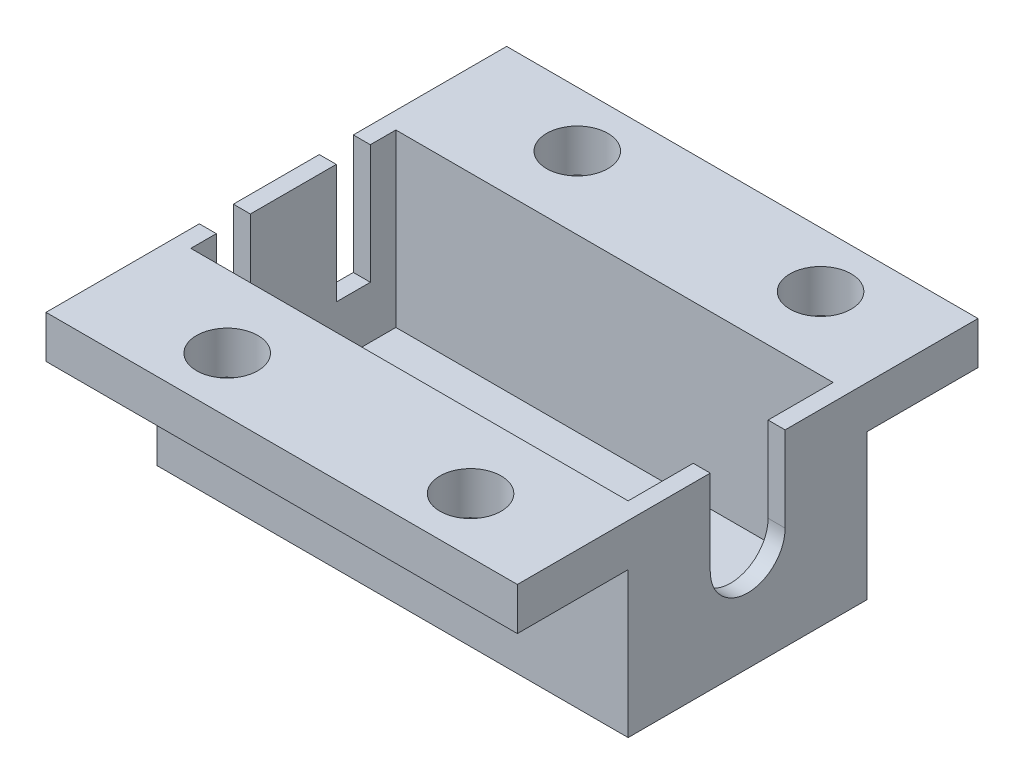
ISO-10303-21;
HEADER;
FILE_DESCRIPTION(('STEP AP214'),'2;1');
FILE_NAME('part.step','',(''),(''),'','','');
FILE_SCHEMA(('AUTOMOTIVE_DESIGN { 1 0 10303 214 1 1 1 1 }'));
ENDSEC;
DATA;
#1=APPLICATION_CONTEXT('core data for automotive mechanical design processes');
#2=APPLICATION_PROTOCOL_DEFINITION('international standard','automotive_design',2000,#1);
#3=PRODUCT_CONTEXT('',#1,'mechanical');
#4=PRODUCT('Part','Part','',(#3));
#5=PRODUCT_RELATED_PRODUCT_CATEGORY('part','',(#4));
#6=PRODUCT_DEFINITION_FORMATION('','',#4);
#7=PRODUCT_DEFINITION_CONTEXT('part definition',#1,'design');
#8=PRODUCT_DEFINITION('design','',#6,#7);
#9=PRODUCT_DEFINITION_SHAPE('','',#8);
#10=(LENGTH_UNIT() NAMED_UNIT(*) SI_UNIT(.MILLI.,.METRE.));
#11=(NAMED_UNIT(*) PLANE_ANGLE_UNIT() SI_UNIT($,.RADIAN.));
#12=(NAMED_UNIT(*) SI_UNIT($,.STERADIAN.) SOLID_ANGLE_UNIT());
#13=UNCERTAINTY_MEASURE_WITH_UNIT(LENGTH_MEASURE(1.E-05),#10,'distance_accuracy_value','');
#14=(GEOMETRIC_REPRESENTATION_CONTEXT(3) GLOBAL_UNCERTAINTY_ASSIGNED_CONTEXT((#13)) GLOBAL_UNIT_ASSIGNED_CONTEXT((#10,
#11,#12)) REPRESENTATION_CONTEXT('',''));
#15=CARTESIAN_POINT('',(0.,0.,0.));
#16=DIRECTION('',(0.,0.,1.));
#17=DIRECTION('',(1.,0.,0.));
#18=AXIS2_PLACEMENT_3D('',#15,#16,#17);
#19=CARTESIAN_POINT('',(0.,11.05,0.));
#20=DIRECTION('',(0.,1.,0.));
#21=DIRECTION('',(0.,0.,1.));
#22=AXIS2_PLACEMENT_3D('',#19,#20,#21);
#23=PLANE('',#22);
#24=DIRECTION('',(-1.,0.,0.));
#25=VECTOR('',#24,1.);
#26=CARTESIAN_POINT('',(0.,11.05,-4.5));
#27=LINE('',#26,#25);
#28=CARTESIAN_POINT('',(-0.399999999999999,11.05,-4.5));
#29=VERTEX_POINT('',#28);
#30=CARTESIAN_POINT('',(-1.4,11.05,-4.5));
#31=VERTEX_POINT('',#30);
#32=EDGE_CURVE('E240',#29,#31,#27,.T.);
#33=ORIENTED_EDGE('',*,*,#32,.F.);
#34=DIRECTION('',(0.,0.,1.));
#35=VECTOR('',#34,1.);
#36=CARTESIAN_POINT('',(-0.4,11.05,-13.05));
#37=LINE('',#36,#35);
#38=CARTESIAN_POINT('',(-0.399999999999999,11.05,-9.55));
#39=VERTEX_POINT('',#38);
#40=EDGE_CURVE('E309',#39,#29,#37,.T.);
#41=ORIENTED_EDGE('',*,*,#40,.F.);
#42=DIRECTION('',(-1.,0.,0.));
#43=VECTOR('',#42,1.);
#44=CARTESIAN_POINT('',(0.,11.05,-9.55));
#45=LINE('',#44,#43);
#46=CARTESIAN_POINT('',(-1.4,11.05,-9.55));
#47=VERTEX_POINT('',#46);
#48=EDGE_CURVE('E314',#39,#47,#45,.T.);
#49=ORIENTED_EDGE('',*,*,#48,.T.);
#50=DIRECTION('',(0.,0.,-1.));
#51=VECTOR('',#50,1.);
#52=CARTESIAN_POINT('',(-1.4,11.05,6.51));
#53=LINE('',#52,#51);
#54=EDGE_CURVE('E248',#31,#47,#53,.T.);
#55=ORIENTED_EDGE('',*,*,#54,.F.);
#56=EDGE_LOOP('',(#33,#41,#49,#55));
#57=FACE_BOUND('',#56,.T.);
#58=ADVANCED_FACE('F34',(#57),#23,.T.);
#59=DIRECTION('',(-1.,0.,0.));
#60=VECTOR('',#59,1.);
#61=CARTESIAN_POINT('',(0.,11.05,-11.55));
#62=LINE('',#61,#60);
#63=CARTESIAN_POINT('',(-0.4,11.05,-11.55));
#64=VERTEX_POINT('',#63);
#65=CARTESIAN_POINT('',(-1.4,11.05,-11.55));
#66=VERTEX_POINT('',#65);
#67=EDGE_CURVE('E313',#64,#66,#62,.T.);
#68=ORIENTED_EDGE('',*,*,#67,.F.);
#69=CARTESIAN_POINT('',(-0.4,11.05,-13.05));
#70=VERTEX_POINT('',#69);
#71=EDGE_CURVE('E306',#70,#64,#37,.T.);
#72=ORIENTED_EDGE('',*,*,#71,.F.);
#73=DIRECTION('',(-1.,0.,0.));
#74=VECTOR('',#73,1.);
#75=CARTESIAN_POINT('',(0.,11.05,-13.05));
#76=LINE('',#75,#74);
#77=CARTESIAN_POINT('',(25.3,11.05,-13.05));
#78=VERTEX_POINT('',#77);
#79=EDGE_CURVE('E481',#78,#70,#76,.T.);
#80=ORIENTED_EDGE('',*,*,#79,.F.);
#81=DIRECTION('',(0.,0.,1.));
#82=VECTOR('',#81,1.);
#83=CARTESIAN_POINT('',(25.3,11.05,0.));
#84=LINE('',#83,#82);
#85=CARTESIAN_POINT('',(25.3,11.05,-9.225));
#86=VERTEX_POINT('',#85);
#87=EDGE_CURVE('E484',#78,#86,#84,.T.);
#88=ORIENTED_EDGE('',*,*,#87,.T.);
#89=DIRECTION('',(-1.,0.,0.));
#90=VECTOR('',#89,1.);
#91=CARTESIAN_POINT('',(0.,11.05,-9.225));
#92=LINE('',#91,#90);
#93=CARTESIAN_POINT('',(26.3,11.05,-9.225));
#94=VERTEX_POINT('',#93);
#95=EDGE_CURVE('E387',#94,#86,#92,.T.);
#96=ORIENTED_EDGE('',*,*,#95,.F.);
#97=DIRECTION('',(0.,0.,-1.));
#98=VECTOR('',#97,1.);
#99=CARTESIAN_POINT('',(26.3,11.05,0.));
#100=LINE('',#99,#98);
#101=CARTESIAN_POINT('',(26.3,11.05,-20.56));
#102=VERTEX_POINT('',#101);
#103=EDGE_CURVE('E351',#94,#102,#100,.T.);
#104=ORIENTED_EDGE('',*,*,#103,.T.);
#105=DIRECTION('',(-1.,0.,0.));
#106=VECTOR('',#105,1.);
#107=CARTESIAN_POINT('',(0.,11.05,-20.56));
#108=LINE('',#107,#106);
#109=CARTESIAN_POINT('',(-1.4,11.05,-20.56));
#110=VERTEX_POINT('',#109);
#111=EDGE_CURVE('E347',#102,#110,#108,.T.);
#112=ORIENTED_EDGE('',*,*,#111,.T.);
#113=EDGE_CURVE('E250',#66,#110,#53,.T.);
#114=ORIENTED_EDGE('',*,*,#113,.F.);
#115=EDGE_LOOP('',(#68,#72,#80,#88,#96,#104,#112,#114));
#116=FACE_BOUND('',#115,.T.);
#117=CARTESIAN_POINT('',(6.,11.05,-17.31));
#118=DIRECTION('',(0.,1.,0.));
#119=DIRECTION('',(0.,0.,1.));
#120=AXIS2_PLACEMENT_3D('',#117,#118,#119);
#121=CIRCLE('',#120,1.8);
#122=CARTESIAN_POINT('',(6.,11.05,-15.51));
#123=VERTEX_POINT('',#122);
#124=EDGE_CURVE('E441',#123,#123,#121,.T.);
#125=ORIENTED_EDGE('',*,*,#124,.F.);
#126=EDGE_LOOP('',(#125));
#127=FACE_BOUND('',#126,.T.);
#128=CARTESIAN_POINT('',(20.3,11.05,-17.31));
#129=DIRECTION('',(0.,1.,0.));
#130=DIRECTION('',(0.,0.,1.));
#131=AXIS2_PLACEMENT_3D('',#128,#129,#130);
#132=CIRCLE('',#131,1.8);
#133=CARTESIAN_POINT('',(20.3,11.05,-15.51));
#134=VERTEX_POINT('',#133);
#135=EDGE_CURVE('E437',#134,#134,#132,.T.);
#136=ORIENTED_EDGE('',*,*,#135,.F.);
#137=EDGE_LOOP('',(#136));
#138=FACE_BOUND('',#137,.T.);
#139=ADVANCED_FACE('F344',(#116,#127,#138),#23,.T.);
#140=CARTESIAN_POINT('',(0.,1.,0.));
#141=DIRECTION('',(0.,0.,-1.));
#142=DIRECTION('',(-1.,0.,0.));
#143=AXIS2_PLACEMENT_3D('',#140,#141,#142);
#144=PLANE('',#143);
#145=DIRECTION('',(0.,-1.,0.));
#146=VECTOR('',#145,1.);
#147=CARTESIAN_POINT('',(26.3,1.,0.));
#148=LINE('',#147,#146);
#149=CARTESIAN_POINT('',(26.3,8.55,0.));
#150=VERTEX_POINT('',#149);
#151=CARTESIAN_POINT('',(26.3,0.,0.));
#152=VERTEX_POINT('',#151);
#153=EDGE_CURVE('E378',#150,#152,#148,.T.);
#154=ORIENTED_EDGE('',*,*,#153,.F.);
#155=DIRECTION('',(-1.,0.,0.));
#156=VECTOR('',#155,1.);
#157=CARTESIAN_POINT('',(0.,8.55,0.));
#158=LINE('',#157,#156);
#159=CARTESIAN_POINT('',(-1.4,8.55,0.));
#160=VERTEX_POINT('',#159);
#161=EDGE_CURVE('E475',#150,#160,#158,.T.);
#162=ORIENTED_EDGE('',*,*,#161,.T.);
#163=DIRECTION('',(0.,1.,0.));
#164=VECTOR('',#163,1.);
#165=CARTESIAN_POINT('',(-1.4,0.,0.));
#166=LINE('',#165,#164);
#167=CARTESIAN_POINT('',(-1.4,0.,0.));
#168=VERTEX_POINT('',#167);
#169=EDGE_CURVE('E260',#168,#160,#166,.T.);
#170=ORIENTED_EDGE('',*,*,#169,.F.);
#171=DIRECTION('',(1.,0.,0.));
#172=VECTOR('',#171,1.);
#173=CARTESIAN_POINT('',(0.,0.,0.));
#174=LINE('',#173,#172);
#175=EDGE_CURVE('E380',#168,#152,#174,.T.);
#176=ORIENTED_EDGE('',*,*,#175,.T.);
#177=EDGE_LOOP('',(#154,#162,#170,#176));
#178=FACE_BOUND('',#177,.T.);
#179=ADVANCED_FACE('F36',(#178),#144,.F.);
#180=CARTESIAN_POINT('',(26.3,1.,0.));
#181=DIRECTION('',(-1.,0.,0.));
#182=DIRECTION('',(0.,0.,1.));
#183=AXIS2_PLACEMENT_3D('',#180,#181,#182);
#184=PLANE('',#183);
#185=DIRECTION('',(0.,1.,0.));
#186=VECTOR('',#185,1.);
#187=CARTESIAN_POINT('',(26.3,11.05,-9.225));
#188=LINE('',#187,#186);
#189=CARTESIAN_POINT('',(26.3,6.05,-9.225));
#190=VERTEX_POINT('',#189);
#191=EDGE_CURVE('E421',#190,#94,#188,.T.);
#192=ORIENTED_EDGE('',*,*,#191,.F.);
#193=CARTESIAN_POINT('',(26.3,6.05,-7.025));
#194=DIRECTION('',(1.,0.,0.));
#195=DIRECTION('',(0.,0.,-1.));
#196=AXIS2_PLACEMENT_3D('',#193,#194,#195);
#197=CIRCLE('',#196,2.2);
#198=CARTESIAN_POINT('',(26.3,6.05,-4.825));
#199=VERTEX_POINT('',#198);
#200=EDGE_CURVE('E411',#199,#190,#197,.T.);
#201=ORIENTED_EDGE('',*,*,#200,.F.);
#202=DIRECTION('',(0.,-1.,0.));
#203=VECTOR('',#202,1.);
#204=CARTESIAN_POINT('',(26.3,11.05,-4.825));
#205=LINE('',#204,#203);
#206=CARTESIAN_POINT('',(26.3,11.05,-4.825));
#207=VERTEX_POINT('',#206);
#208=EDGE_CURVE('E423',#207,#199,#205,.T.);
#209=ORIENTED_EDGE('',*,*,#208,.F.);
#210=CARTESIAN_POINT('',(26.3,11.05,6.51));
#211=VERTEX_POINT('',#210);
#212=EDGE_CURVE('E478',#211,#207,#100,.T.);
#213=ORIENTED_EDGE('',*,*,#212,.F.);
#214=DIRECTION('',(0.,1.,0.));
#215=VECTOR('',#214,1.);
#216=CARTESIAN_POINT('',(26.3,8.55,6.51));
#217=LINE('',#216,#215);
#218=CARTESIAN_POINT('',(26.3,8.55,6.51));
#219=VERTEX_POINT('',#218);
#220=EDGE_CURVE('E468',#219,#211,#217,.T.);
#221=ORIENTED_EDGE('',*,*,#220,.F.);
#222=DIRECTION('',(0.,0.,-1.));
#223=VECTOR('',#222,1.);
#224=CARTESIAN_POINT('',(26.3,8.55,6.51));
#225=LINE('',#224,#223);
#226=EDGE_CURVE('E464',#219,#150,#225,.T.);
#227=ORIENTED_EDGE('',*,*,#226,.T.);
#228=ORIENTED_EDGE('',*,*,#153,.T.);
#229=DIRECTION('',(0.,0.,-1.));
#230=VECTOR('',#229,1.);
#231=CARTESIAN_POINT('',(26.3,0.,0.));
#232=LINE('',#231,#230);
#233=CARTESIAN_POINT('',(26.3,0.,-14.05));
#234=VERTEX_POINT('',#233);
#235=EDGE_CURVE('E376',#152,#234,#232,.T.);
#236=ORIENTED_EDGE('',*,*,#235,.T.);
#237=DIRECTION('',(0.,-1.,0.));
#238=VECTOR('',#237,1.);
#239=CARTESIAN_POINT('',(26.3,1.,-14.05));
#240=LINE('',#239,#238);
#241=CARTESIAN_POINT('',(26.3,8.55,-14.05));
#242=VERTEX_POINT('',#241);
#243=EDGE_CURVE('E372',#242,#234,#240,.T.);
#244=ORIENTED_EDGE('',*,*,#243,.F.);
#245=CARTESIAN_POINT('',(26.3,8.55,-20.56));
#246=VERTEX_POINT('',#245);
#247=EDGE_CURVE('E463',#242,#246,#225,.T.);
#248=ORIENTED_EDGE('',*,*,#247,.T.);
#249=DIRECTION('',(0.,1.,0.));
#250=VECTOR('',#249,1.);
#251=CARTESIAN_POINT('',(26.3,8.55,-20.56));
#252=LINE('',#251,#250);
#253=EDGE_CURVE('E470',#246,#102,#252,.T.);
#254=ORIENTED_EDGE('',*,*,#253,.T.);
#255=ORIENTED_EDGE('',*,*,#103,.F.);
#256=EDGE_LOOP('',(#192,#201,#209,#213,#221,#227,#228,#236,#244,#248,#254,#255));
#257=FACE_BOUND('',#256,.T.);
#258=ADVANCED_FACE('F507',(#257),#184,.F.);
#259=CARTESIAN_POINT('',(0.,1.,-14.05));
#260=DIRECTION('',(0.,0.,1.));
#261=DIRECTION('',(1.,0.,0.));
#262=AXIS2_PLACEMENT_3D('',#259,#260,#261);
#263=PLANE('',#262);
#264=DIRECTION('',(-1.,0.,0.));
#265=VECTOR('',#264,1.);
#266=CARTESIAN_POINT('',(0.,0.,-14.05));
#267=LINE('',#266,#265);
#268=CARTESIAN_POINT('',(-1.4,0.,-14.05));
#269=VERTEX_POINT('',#268);
#270=EDGE_CURVE('E371',#234,#269,#267,.T.);
#271=ORIENTED_EDGE('',*,*,#270,.T.);
#272=DIRECTION('',(0.,-1.,0.));
#273=VECTOR('',#272,1.);
#274=CARTESIAN_POINT('',(-1.4,8.55,-14.05));
#275=LINE('',#274,#273);
#276=CARTESIAN_POINT('',(-1.4,8.55,-14.05));
#277=VERTEX_POINT('',#276);
#278=EDGE_CURVE('E268',#277,#269,#275,.T.);
#279=ORIENTED_EDGE('',*,*,#278,.F.);
#280=DIRECTION('',(1.,0.,0.));
#281=VECTOR('',#280,1.);
#282=CARTESIAN_POINT('',(0.,8.55,-14.05));
#283=LINE('',#282,#281);
#284=EDGE_CURVE('E368',#277,#242,#283,.T.);
#285=ORIENTED_EDGE('',*,*,#284,.T.);
#286=ORIENTED_EDGE('',*,*,#243,.T.);
#287=EDGE_LOOP('',(#271,#279,#285,#286));
#288=FACE_BOUND('',#287,.T.);
#289=ADVANCED_FACE('F367',(#288),#263,.F.);
#290=CARTESIAN_POINT('',(0.,0.,0.));
#291=DIRECTION('',(0.,-1.,0.));
#292=DIRECTION('',(0.,0.,-1.));
#293=AXIS2_PLACEMENT_3D('',#290,#291,#292);
#294=PLANE('',#293);
#295=DIRECTION('',(1.,0.,0.));
#296=VECTOR('',#295,1.);
#297=CARTESIAN_POINT('',(14.5,0.,-11.025));
#298=LINE('',#297,#296);
#299=CARTESIAN_POINT('',(4.5,0.,-11.025));
#300=VERTEX_POINT('',#299);
#301=CARTESIAN_POINT('',(14.5,0.,-11.025));
#302=VERTEX_POINT('',#301);
#303=EDGE_CURVE('E410',#300,#302,#298,.T.);
#304=ORIENTED_EDGE('',*,*,#303,.F.);
#305=DIRECTION('',(0.,0.,1.));
#306=VECTOR('',#305,1.);
#307=CARTESIAN_POINT('',(4.5,0.,-3.025));
#308=LINE('',#307,#306);
#309=CARTESIAN_POINT('',(4.5,0.,-3.025));
#310=VERTEX_POINT('',#309);
#311=EDGE_CURVE('E247',#300,#310,#308,.T.);
#312=ORIENTED_EDGE('',*,*,#311,.T.);
#313=DIRECTION('',(-1.,0.,0.));
#314=VECTOR('',#313,1.);
#315=CARTESIAN_POINT('',(14.5,0.,-3.025));
#316=LINE('',#315,#314);
#317=CARTESIAN_POINT('',(14.5,0.,-3.025));
#318=VERTEX_POINT('',#317);
#319=EDGE_CURVE('E927',#318,#310,#316,.T.);
#320=ORIENTED_EDGE('',*,*,#319,.F.);
#321=DIRECTION('',(0.,0.,1.));
#322=VECTOR('',#321,1.);
#323=CARTESIAN_POINT('',(14.5,0.,-11.025));
#324=LINE('',#323,#322);
#325=EDGE_CURVE('E925',#302,#318,#324,.T.);
#326=ORIENTED_EDGE('',*,*,#325,.F.);
#327=EDGE_LOOP('',(#304,#312,#320,#326));
#328=FACE_BOUND('',#327,.T.);
#329=ORIENTED_EDGE('',*,*,#175,.F.);
#330=DIRECTION('',(0.,0.,1.));
#331=VECTOR('',#330,1.);
#332=CARTESIAN_POINT('',(-1.4,0.,-14.05));
#333=LINE('',#332,#331);
#334=EDGE_CURVE('E265',#269,#168,#333,.T.);
#335=ORIENTED_EDGE('',*,*,#334,.F.);
#336=ORIENTED_EDGE('',*,*,#270,.F.);
#337=ORIENTED_EDGE('',*,*,#235,.F.);
#338=EDGE_LOOP('',(#329,#335,#336,#337));
#339=FACE_BOUND('',#338,.T.);
#340=ADVANCED_FACE('F504',(#328,#339),#294,.T.);
#341=CARTESIAN_POINT('',(0.,11.05,-13.05));
#342=DIRECTION('',(0.,0.,1.));
#343=DIRECTION('',(1.,0.,0.));
#344=AXIS2_PLACEMENT_3D('',#341,#342,#343);
#345=PLANE('',#344);
#346=DIRECTION('',(-1.,0.,0.));
#347=VECTOR('',#346,1.);
#348=CARTESIAN_POINT('',(0.,1.,-13.05));
#349=LINE('',#348,#347);
#350=CARTESIAN_POINT('',(25.3,1.,-13.05));
#351=VERTEX_POINT('',#350);
#352=CARTESIAN_POINT('',(-0.4,1.,-13.05));
#353=VERTEX_POINT('',#352);
#354=EDGE_CURVE('E477',#351,#353,#349,.T.);
#355=ORIENTED_EDGE('',*,*,#354,.F.);
#356=DIRECTION('',(0.,-1.,0.));
#357=VECTOR('',#356,1.);
#358=CARTESIAN_POINT('',(25.3,11.05,-13.05));
#359=LINE('',#358,#357);
#360=EDGE_CURVE('E499',#78,#351,#359,.T.);
#361=ORIENTED_EDGE('',*,*,#360,.F.);
#362=ORIENTED_EDGE('',*,*,#79,.T.);
#363=DIRECTION('',(0.,1.,0.));
#364=VECTOR('',#363,1.);
#365=CARTESIAN_POINT('',(-0.4,11.05,-13.05));
#366=LINE('',#365,#364);
#367=EDGE_CURVE('E310',#353,#70,#366,.T.);
#368=ORIENTED_EDGE('',*,*,#367,.F.);
#369=EDGE_LOOP('',(#355,#361,#362,#368));
#370=FACE_BOUND('',#369,.T.);
#371=ADVANCED_FACE('F534',(#370),#345,.T.);
#372=CARTESIAN_POINT('',(25.3,11.05,0.));
#373=DIRECTION('',(1.,0.,0.));
#374=DIRECTION('',(0.,0.,-1.));
#375=AXIS2_PLACEMENT_3D('',#372,#373,#374);
#376=PLANE('',#375);
#377=DIRECTION('',(0.,-1.,0.));
#378=VECTOR('',#377,1.);
#379=CARTESIAN_POINT('',(25.3,11.05,-4.825));
#380=LINE('',#379,#378);
#381=CARTESIAN_POINT('',(25.3,11.05,-4.825));
#382=VERTEX_POINT('',#381);
#383=CARTESIAN_POINT('',(25.3,6.05,-4.825));
#384=VERTEX_POINT('',#383);
#385=EDGE_CURVE('E430',#382,#384,#380,.T.);
#386=ORIENTED_EDGE('',*,*,#385,.T.);
#387=CARTESIAN_POINT('',(25.3,6.05,-7.025));
#388=DIRECTION('',(1.,0.,0.));
#389=DIRECTION('',(0.,0.,-1.));
#390=AXIS2_PLACEMENT_3D('',#387,#388,#389);
#391=CIRCLE('',#390,2.2);
#392=CARTESIAN_POINT('',(25.3,6.05,-9.225));
#393=VERTEX_POINT('',#392);
#394=EDGE_CURVE('E413',#384,#393,#391,.T.);
#395=ORIENTED_EDGE('',*,*,#394,.T.);
#396=DIRECTION('',(0.,1.,0.));
#397=VECTOR('',#396,1.);
#398=CARTESIAN_POINT('',(25.3,11.05,-9.225));
#399=LINE('',#398,#397);
#400=EDGE_CURVE('E434',#393,#86,#399,.T.);
#401=ORIENTED_EDGE('',*,*,#400,.T.);
#402=ORIENTED_EDGE('',*,*,#87,.F.);
#403=ORIENTED_EDGE('',*,*,#360,.T.);
#404=DIRECTION('',(0.,0.,1.));
#405=VECTOR('',#404,1.);
#406=CARTESIAN_POINT('',(25.3,1.,0.));
#407=LINE('',#406,#405);
#408=CARTESIAN_POINT('',(25.3,1.,-1.));
#409=VERTEX_POINT('',#408);
#410=EDGE_CURVE('E492',#351,#409,#407,.T.);
#411=ORIENTED_EDGE('',*,*,#410,.T.);
#412=DIRECTION('',(0.,-1.,0.));
#413=VECTOR('',#412,1.);
#414=CARTESIAN_POINT('',(25.3,11.05,-1.));
#415=LINE('',#414,#413);
#416=CARTESIAN_POINT('',(25.3,11.05,-1.));
#417=VERTEX_POINT('',#416);
#418=EDGE_CURVE('E490',#417,#409,#415,.T.);
#419=ORIENTED_EDGE('',*,*,#418,.F.);
#420=EDGE_CURVE('E483',#382,#417,#84,.T.);
#421=ORIENTED_EDGE('',*,*,#420,.F.);
#422=EDGE_LOOP('',(#386,#395,#401,#402,#403,#411,#419,#421));
#423=FACE_BOUND('',#422,.T.);
#424=ADVANCED_FACE('F522',(#423),#376,.F.);
#425=CARTESIAN_POINT('',(0.,11.05,-1.));
#426=DIRECTION('',(0.,0.,-1.));
#427=DIRECTION('',(-1.,0.,0.));
#428=AXIS2_PLACEMENT_3D('',#425,#426,#427);
#429=PLANE('',#428);
#430=DIRECTION('',(1.,0.,0.));
#431=VECTOR('',#430,1.);
#432=CARTESIAN_POINT('',(0.,1.,-1.));
#433=LINE('',#432,#431);
#434=CARTESIAN_POINT('',(-0.399999999999998,1.,-1.));
#435=VERTEX_POINT('',#434);
#436=EDGE_CURVE('E495',#435,#409,#433,.T.);
#437=ORIENTED_EDGE('',*,*,#436,.F.);
#438=DIRECTION('',(0.,-1.,0.));
#439=VECTOR('',#438,1.);
#440=CARTESIAN_POINT('',(-0.399999999999998,11.05,-1.));
#441=LINE('',#440,#439);
#442=CARTESIAN_POINT('',(-0.399999999999998,11.05,-1.));
#443=VERTEX_POINT('',#442);
#444=EDGE_CURVE('E303',#443,#435,#441,.T.);
#445=ORIENTED_EDGE('',*,*,#444,.F.);
#446=DIRECTION('',(1.,0.,0.));
#447=VECTOR('',#446,1.);
#448=CARTESIAN_POINT('',(0.,11.05,-1.));
#449=LINE('',#448,#447);
#450=EDGE_CURVE('E487',#443,#417,#449,.T.);
#451=ORIENTED_EDGE('',*,*,#450,.T.);
#452=ORIENTED_EDGE('',*,*,#418,.T.);
#453=EDGE_LOOP('',(#437,#445,#451,#452));
#454=FACE_BOUND('',#453,.T.);
#455=ADVANCED_FACE('F527',(#454),#429,.T.);
#456=DIRECTION('',(-1.,0.,0.));
#457=VECTOR('',#456,1.);
#458=CARTESIAN_POINT('',(0.,11.05,-2.5));
#459=LINE('',#458,#457);
#460=CARTESIAN_POINT('',(-0.399999999999999,11.05,-2.5));
#461=VERTEX_POINT('',#460);
#462=CARTESIAN_POINT('',(-1.4,11.05,-2.5));
#463=VERTEX_POINT('',#462);
#464=EDGE_CURVE('E221',#461,#463,#459,.T.);
#465=ORIENTED_EDGE('',*,*,#464,.T.);
#466=CARTESIAN_POINT('',(-1.4,11.05,6.51));
#467=VERTEX_POINT('',#466);
#468=EDGE_CURVE('E237',#467,#463,#53,.T.);
#469=ORIENTED_EDGE('',*,*,#468,.F.);
#470=DIRECTION('',(1.,0.,0.));
#471=VECTOR('',#470,1.);
#472=CARTESIAN_POINT('',(0.,11.05,6.51));
#473=LINE('',#472,#471);
#474=EDGE_CURVE('E356',#467,#211,#473,.T.);
#475=ORIENTED_EDGE('',*,*,#474,.T.);
#476=ORIENTED_EDGE('',*,*,#212,.T.);
#477=DIRECTION('',(1.,0.,0.));
#478=VECTOR('',#477,1.);
#479=CARTESIAN_POINT('',(0.,11.05,-4.825));
#480=LINE('',#479,#478);
#481=EDGE_CURVE('E385',#382,#207,#480,.T.);
#482=ORIENTED_EDGE('',*,*,#481,.F.);
#483=ORIENTED_EDGE('',*,*,#420,.T.);
#484=ORIENTED_EDGE('',*,*,#450,.F.);
#485=EDGE_CURVE('E239',#461,#443,#37,.T.);
#486=ORIENTED_EDGE('',*,*,#485,.F.);
#487=EDGE_LOOP('',(#465,#469,#475,#476,#482,#483,#484,#486));
#488=FACE_BOUND('',#487,.T.);
#489=CARTESIAN_POINT('',(6.,11.05,3.26));
#490=DIRECTION('',(0.,1.,0.));
#491=DIRECTION('',(0.,0.,1.));
#492=AXIS2_PLACEMENT_3D('',#489,#490,#491);
#493=CIRCLE('',#492,1.8);
#494=CARTESIAN_POINT('',(6.,11.05,5.06));
#495=VERTEX_POINT('',#494);
#496=EDGE_CURVE('E453',#495,#495,#493,.T.);
#497=ORIENTED_EDGE('',*,*,#496,.F.);
#498=EDGE_LOOP('',(#497));
#499=FACE_BOUND('',#498,.T.);
#500=CARTESIAN_POINT('',(20.3,11.05,3.26));
#501=DIRECTION('',(0.,1.,0.));
#502=DIRECTION('',(0.,0.,1.));
#503=AXIS2_PLACEMENT_3D('',#500,#501,#502);
#504=CIRCLE('',#503,1.8);
#505=CARTESIAN_POINT('',(20.3,11.05,5.06));
#506=VERTEX_POINT('',#505);
#507=EDGE_CURVE('E447',#506,#506,#504,.T.);
#508=ORIENTED_EDGE('',*,*,#507,.F.);
#509=EDGE_LOOP('',(#508));
#510=FACE_BOUND('',#509,.T.);
#511=ADVANCED_FACE('F234',(#488,#499,#510),#23,.T.);
#512=CARTESIAN_POINT('',(0.,1.,0.));
#513=DIRECTION('',(0.,-1.,0.));
#514=DIRECTION('',(0.,0.,-1.));
#515=AXIS2_PLACEMENT_3D('',#512,#513,#514);
#516=PLANE('',#515);
#517=DIRECTION('',(0.,0.,1.));
#518=VECTOR('',#517,1.);
#519=CARTESIAN_POINT('',(4.5,1.,-3.025));
#520=LINE('',#519,#518);
#521=CARTESIAN_POINT('',(4.5,1.,-11.025));
#522=VERTEX_POINT('',#521);
#523=CARTESIAN_POINT('',(4.5,1.,-3.025));
#524=VERTEX_POINT('',#523);
#525=EDGE_CURVE('E252',#522,#524,#520,.T.);
#526=ORIENTED_EDGE('',*,*,#525,.F.);
#527=DIRECTION('',(1.,0.,0.));
#528=VECTOR('',#527,1.);
#529=CARTESIAN_POINT('',(0.,1.,-11.025));
#530=LINE('',#529,#528);
#531=CARTESIAN_POINT('',(14.5,1.,-11.025));
#532=VERTEX_POINT('',#531);
#533=EDGE_CURVE('E42',#522,#532,#530,.T.);
#534=ORIENTED_EDGE('',*,*,#533,.T.);
#535=DIRECTION('',(0.,0.,1.));
#536=VECTOR('',#535,1.);
#537=CARTESIAN_POINT('',(14.5,1.,0.));
#538=LINE('',#537,#536);
#539=CARTESIAN_POINT('',(14.5,1.,-3.025));
#540=VERTEX_POINT('',#539);
#541=EDGE_CURVE('E11',#532,#540,#538,.T.);
#542=ORIENTED_EDGE('',*,*,#541,.T.);
#543=DIRECTION('',(-1.,0.,0.));
#544=VECTOR('',#543,1.);
#545=CARTESIAN_POINT('',(0.,1.,-3.025));
#546=LINE('',#545,#544);
#547=EDGE_CURVE('E389',#540,#524,#546,.T.);
#548=ORIENTED_EDGE('',*,*,#547,.T.);
#549=EDGE_LOOP('',(#526,#534,#542,#548));
#550=FACE_BOUND('',#549,.T.);
#551=ORIENTED_EDGE('',*,*,#410,.F.);
#552=ORIENTED_EDGE('',*,*,#354,.T.);
#553=DIRECTION('',(0.,0.,-1.));
#554=VECTOR('',#553,1.);
#555=CARTESIAN_POINT('',(-0.4,1.,-13.05));
#556=LINE('',#555,#554);
#557=EDGE_CURVE('E300',#435,#353,#556,.T.);
#558=ORIENTED_EDGE('',*,*,#557,.F.);
#559=ORIENTED_EDGE('',*,*,#436,.T.);
#560=EDGE_LOOP('',(#551,#552,#558,#559));
#561=FACE_BOUND('',#560,.T.);
#562=ADVANCED_FACE('F394',(#550,#561),#516,.F.);
#563=CARTESIAN_POINT('',(0.,8.55,-20.56));
#564=DIRECTION('',(0.,0.,-1.));
#565=DIRECTION('',(-1.,0.,0.));
#566=AXIS2_PLACEMENT_3D('',#563,#564,#565);
#567=PLANE('',#566);
#568=ORIENTED_EDGE('',*,*,#111,.F.);
#569=ORIENTED_EDGE('',*,*,#253,.F.);
#570=DIRECTION('',(-1.,0.,0.));
#571=VECTOR('',#570,1.);
#572=CARTESIAN_POINT('',(0.,8.55,-20.56));
#573=LINE('',#572,#571);
#574=CARTESIAN_POINT('',(-1.4,8.55,-20.56));
#575=VERTEX_POINT('',#574);
#576=EDGE_CURVE('E360',#246,#575,#573,.T.);
#577=ORIENTED_EDGE('',*,*,#576,.T.);
#578=DIRECTION('',(0.,-1.,0.));
#579=VECTOR('',#578,1.);
#580=CARTESIAN_POINT('',(-1.4,11.05,-20.56));
#581=LINE('',#580,#579);
#582=EDGE_CURVE('E274',#110,#575,#581,.T.);
#583=ORIENTED_EDGE('',*,*,#582,.F.);
#584=EDGE_LOOP('',(#568,#569,#577,#583));
#585=FACE_BOUND('',#584,.T.);
#586=ADVANCED_FACE('F358',(#585),#567,.T.);
#587=CARTESIAN_POINT('',(0.,8.55,0.));
#588=DIRECTION('',(0.,-1.,0.));
#589=DIRECTION('',(0.,0.,-1.));
#590=AXIS2_PLACEMENT_3D('',#587,#588,#589);
#591=PLANE('',#590);
#592=CARTESIAN_POINT('',(20.3,8.55,-17.31));
#593=DIRECTION('',(0.,1.,0.));
#594=DIRECTION('',(0.,0.,1.));
#595=AXIS2_PLACEMENT_3D('',#592,#593,#594);
#596=CIRCLE('',#595,1.8);
#597=CARTESIAN_POINT('',(20.3,8.55,-15.51));
#598=VERTEX_POINT('',#597);
#599=EDGE_CURVE('E438',#598,#598,#596,.T.);
#600=ORIENTED_EDGE('',*,*,#599,.T.);
#601=EDGE_LOOP('',(#600));
#602=FACE_BOUND('',#601,.T.);
#603=CARTESIAN_POINT('',(6.,8.55,-17.31));
#604=DIRECTION('',(0.,1.,0.));
#605=DIRECTION('',(0.,0.,1.));
#606=AXIS2_PLACEMENT_3D('',#603,#604,#605);
#607=CIRCLE('',#606,1.8);
#608=CARTESIAN_POINT('',(6.,8.55,-15.51));
#609=VERTEX_POINT('',#608);
#610=EDGE_CURVE('E444',#609,#609,#607,.T.);
#611=ORIENTED_EDGE('',*,*,#610,.T.);
#612=EDGE_LOOP('',(#611));
#613=FACE_BOUND('',#612,.T.);
#614=ORIENTED_EDGE('',*,*,#284,.F.);
#615=DIRECTION('',(0.,0.,1.));
#616=VECTOR('',#615,1.);
#617=CARTESIAN_POINT('',(-1.4,8.55,-20.56));
#618=LINE('',#617,#616);
#619=EDGE_CURVE('E271',#575,#277,#618,.T.);
#620=ORIENTED_EDGE('',*,*,#619,.F.);
#621=ORIENTED_EDGE('',*,*,#576,.F.);
#622=ORIENTED_EDGE('',*,*,#247,.F.);
#623=EDGE_LOOP('',(#614,#620,#621,#622));
#624=FACE_BOUND('',#623,.T.);
#625=ADVANCED_FACE('F539',(#602,#613,#624),#591,.T.);
#626=CARTESIAN_POINT('',(20.3,8.55,3.26));
#627=DIRECTION('',(0.,1.,0.));
#628=DIRECTION('',(0.,0.,1.));
#629=AXIS2_PLACEMENT_3D('',#626,#627,#628);
#630=CIRCLE('',#629,1.8);
#631=CARTESIAN_POINT('',(20.3,8.55,5.06));
#632=VERTEX_POINT('',#631);
#633=EDGE_CURVE('E450',#632,#632,#630,.T.);
#634=ORIENTED_EDGE('',*,*,#633,.T.);
#635=EDGE_LOOP('',(#634));
#636=FACE_BOUND('',#635,.T.);
#637=CARTESIAN_POINT('',(6.,8.55,3.26));
#638=DIRECTION('',(0.,1.,0.));
#639=DIRECTION('',(0.,0.,1.));
#640=AXIS2_PLACEMENT_3D('',#637,#638,#639);
#641=CIRCLE('',#640,1.8);
#642=CARTESIAN_POINT('',(6.,8.55,5.06));
#643=VERTEX_POINT('',#642);
#644=EDGE_CURVE('E456',#643,#643,#641,.T.);
#645=ORIENTED_EDGE('',*,*,#644,.T.);
#646=EDGE_LOOP('',(#645));
#647=FACE_BOUND('',#646,.T.);
#648=ORIENTED_EDGE('',*,*,#161,.F.);
#649=ORIENTED_EDGE('',*,*,#226,.F.);
#650=DIRECTION('',(1.,0.,0.));
#651=VECTOR('',#650,1.);
#652=CARTESIAN_POINT('',(0.,8.55,6.51));
#653=LINE('',#652,#651);
#654=CARTESIAN_POINT('',(-1.4,8.55,6.51));
#655=VERTEX_POINT('',#654);
#656=EDGE_CURVE('E355',#655,#219,#653,.T.);
#657=ORIENTED_EDGE('',*,*,#656,.F.);
#658=DIRECTION('',(0.,0.,1.));
#659=VECTOR('',#658,1.);
#660=CARTESIAN_POINT('',(-1.4,8.55,0.));
#661=LINE('',#660,#659);
#662=EDGE_CURVE('E259',#160,#655,#661,.T.);
#663=ORIENTED_EDGE('',*,*,#662,.F.);
#664=EDGE_LOOP('',(#648,#649,#657,#663));
#665=FACE_BOUND('',#664,.T.);
#666=ADVANCED_FACE('F510',(#636,#647,#665),#591,.T.);
#667=CARTESIAN_POINT('',(0.,8.55,6.51));
#668=DIRECTION('',(0.,0.,1.));
#669=DIRECTION('',(1.,0.,0.));
#670=AXIS2_PLACEMENT_3D('',#667,#668,#669);
#671=PLANE('',#670);
#672=ORIENTED_EDGE('',*,*,#474,.F.);
#673=DIRECTION('',(0.,1.,0.));
#674=VECTOR('',#673,1.);
#675=CARTESIAN_POINT('',(-1.4,8.55,6.51));
#676=LINE('',#675,#674);
#677=EDGE_CURVE('E246',#655,#467,#676,.T.);
#678=ORIENTED_EDGE('',*,*,#677,.F.);
#679=ORIENTED_EDGE('',*,*,#656,.T.);
#680=ORIENTED_EDGE('',*,*,#220,.T.);
#681=EDGE_LOOP('',(#672,#678,#679,#680));
#682=FACE_BOUND('',#681,.T.);
#683=ADVANCED_FACE('F513',(#682),#671,.T.);
#684=CARTESIAN_POINT('',(6.,8.55,3.26));
#685=DIRECTION('',(0.,1.,0.));
#686=DIRECTION('',(0.,0.,1.));
#687=AXIS2_PLACEMENT_3D('',#684,#685,#686);
#688=CYLINDRICAL_SURFACE('',#687,1.8);
#689=ORIENTED_EDGE('',*,*,#644,.F.);
#690=EDGE_LOOP('',(#689));
#691=FACE_BOUND('',#690,.T.);
#692=ORIENTED_EDGE('',*,*,#496,.T.);
#693=EDGE_LOOP('',(#692));
#694=FACE_BOUND('',#693,.T.);
#695=ADVANCED_FACE('F719',(#691,#694),#688,.F.);
#696=CARTESIAN_POINT('',(20.3,8.55,3.26));
#697=DIRECTION('',(0.,1.,0.));
#698=DIRECTION('',(0.,0.,1.));
#699=AXIS2_PLACEMENT_3D('',#696,#697,#698);
#700=CYLINDRICAL_SURFACE('',#699,1.8);
#701=ORIENTED_EDGE('',*,*,#633,.F.);
#702=EDGE_LOOP('',(#701));
#703=FACE_BOUND('',#702,.T.);
#704=ORIENTED_EDGE('',*,*,#507,.T.);
#705=EDGE_LOOP('',(#704));
#706=FACE_BOUND('',#705,.T.);
#707=ADVANCED_FACE('F848',(#703,#706),#700,.F.);
#708=CARTESIAN_POINT('',(6.,8.55,-17.31));
#709=DIRECTION('',(0.,1.,0.));
#710=DIRECTION('',(0.,0.,1.));
#711=AXIS2_PLACEMENT_3D('',#708,#709,#710);
#712=CYLINDRICAL_SURFACE('',#711,1.8);
#713=ORIENTED_EDGE('',*,*,#610,.F.);
#714=EDGE_LOOP('',(#713));
#715=FACE_BOUND('',#714,.T.);
#716=ORIENTED_EDGE('',*,*,#124,.T.);
#717=EDGE_LOOP('',(#716));
#718=FACE_BOUND('',#717,.T.);
#719=ADVANCED_FACE('F838',(#715,#718),#712,.F.);
#720=CARTESIAN_POINT('',(20.3,8.55,-17.31));
#721=DIRECTION('',(0.,1.,0.));
#722=DIRECTION('',(0.,0.,1.));
#723=AXIS2_PLACEMENT_3D('',#720,#721,#722);
#724=CYLINDRICAL_SURFACE('',#723,1.8);
#725=ORIENTED_EDGE('',*,*,#599,.F.);
#726=EDGE_LOOP('',(#725));
#727=FACE_BOUND('',#726,.T.);
#728=ORIENTED_EDGE('',*,*,#135,.T.);
#729=EDGE_LOOP('',(#728));
#730=FACE_BOUND('',#729,.T.);
#731=ADVANCED_FACE('F816',(#727,#730),#724,.F.);
#732=CARTESIAN_POINT('',(23.8,11.05,-9.225));
#733=DIRECTION('',(0.,0.,-1.));
#734=DIRECTION('',(-1.,0.,0.));
#735=AXIS2_PLACEMENT_3D('',#732,#733,#734);
#736=PLANE('',#735);
#737=DIRECTION('',(1.,0.,0.));
#738=VECTOR('',#737,1.);
#739=CARTESIAN_POINT('',(23.8,6.05,-9.225));
#740=LINE('',#739,#738);
#741=EDGE_CURVE('E427',#393,#190,#740,.T.);
#742=ORIENTED_EDGE('',*,*,#741,.T.);
#743=ORIENTED_EDGE('',*,*,#191,.T.);
#744=ORIENTED_EDGE('',*,*,#95,.T.);
#745=ORIENTED_EDGE('',*,*,#400,.F.);
#746=EDGE_LOOP('',(#742,#743,#744,#745));
#747=FACE_BOUND('',#746,.T.);
#748=ADVANCED_FACE('F538',(#747),#736,.F.);
#749=CARTESIAN_POINT('',(23.8,11.05,-4.825));
#750=DIRECTION('',(0.,0.,1.));
#751=DIRECTION('',(0.,-1.,0.));
#752=AXIS2_PLACEMENT_3D('',#749,#750,#751);
#753=PLANE('',#752);
#754=ORIENTED_EDGE('',*,*,#481,.T.);
#755=ORIENTED_EDGE('',*,*,#208,.T.);
#756=DIRECTION('',(1.,0.,0.));
#757=VECTOR('',#756,1.);
#758=CARTESIAN_POINT('',(23.8,6.05,-4.825));
#759=LINE('',#758,#757);
#760=EDGE_CURVE('E426',#384,#199,#759,.T.);
#761=ORIENTED_EDGE('',*,*,#760,.F.);
#762=ORIENTED_EDGE('',*,*,#385,.F.);
#763=EDGE_LOOP('',(#754,#755,#761,#762));
#764=FACE_BOUND('',#763,.T.);
#765=ADVANCED_FACE('F520',(#764),#753,.F.);
#766=CARTESIAN_POINT('',(23.8,6.05,-7.025));
#767=DIRECTION('',(1.,0.,0.));
#768=DIRECTION('',(0.,0.,-1.));
#769=AXIS2_PLACEMENT_3D('',#766,#767,#768);
#770=CYLINDRICAL_SURFACE('',#769,2.2);
#771=ORIENTED_EDGE('',*,*,#760,.T.);
#772=ORIENTED_EDGE('',*,*,#200,.T.);
#773=ORIENTED_EDGE('',*,*,#741,.F.);
#774=ORIENTED_EDGE('',*,*,#394,.F.);
#775=EDGE_LOOP('',(#771,#772,#773,#774));
#776=FACE_BOUND('',#775,.T.);
#777=ADVANCED_FACE('F790',(#776),#770,.F.);
#778=CARTESIAN_POINT('',(14.5,2.5,-11.025));
#779=DIRECTION('',(1.,0.,0.));
#780=DIRECTION('',(0.,0.,-1.));
#781=AXIS2_PLACEMENT_3D('',#778,#779,#780);
#782=PLANE('',#781);
#783=DIRECTION('',(0.,-1.,0.));
#784=VECTOR('',#783,1.);
#785=CARTESIAN_POINT('',(14.5,2.5,-11.025));
#786=LINE('',#785,#784);
#787=EDGE_CURVE('E404',#532,#302,#786,.T.);
#788=ORIENTED_EDGE('',*,*,#787,.T.);
#789=ORIENTED_EDGE('',*,*,#325,.T.);
#790=DIRECTION('',(0.,-1.,0.));
#791=VECTOR('',#790,1.);
#792=CARTESIAN_POINT('',(14.5,2.5,-3.025));
#793=LINE('',#792,#791);
#794=EDGE_CURVE('E407',#540,#318,#793,.T.);
#795=ORIENTED_EDGE('',*,*,#794,.F.);
#796=ORIENTED_EDGE('',*,*,#541,.F.);
#797=EDGE_LOOP('',(#788,#789,#795,#796));
#798=FACE_BOUND('',#797,.T.);
#799=ADVANCED_FACE('F403',(#798),#782,.F.);
#800=CARTESIAN_POINT('',(14.5,2.5,-11.025));
#801=DIRECTION('',(0.,0.,-1.));
#802=DIRECTION('',(-1.,0.,0.));
#803=AXIS2_PLACEMENT_3D('',#800,#801,#802);
#804=PLANE('',#803);
#805=ORIENTED_EDGE('',*,*,#533,.F.);
#806=DIRECTION('',(0.,-1.,0.));
#807=VECTOR('',#806,1.);
#808=CARTESIAN_POINT('',(4.5,1.,-11.025));
#809=LINE('',#808,#807);
#810=EDGE_CURVE('E935',#522,#300,#809,.T.);
#811=ORIENTED_EDGE('',*,*,#810,.T.);
#812=ORIENTED_EDGE('',*,*,#303,.T.);
#813=ORIENTED_EDGE('',*,*,#787,.F.);
#814=EDGE_LOOP('',(#805,#811,#812,#813));
#815=FACE_BOUND('',#814,.T.);
#816=ADVANCED_FACE('F408',(#815),#804,.F.);
#817=CARTESIAN_POINT('',(14.5,2.5,-3.025));
#818=DIRECTION('',(0.,0.,1.));
#819=DIRECTION('',(1.,0.,0.));
#820=AXIS2_PLACEMENT_3D('',#817,#818,#819);
#821=PLANE('',#820);
#822=ORIENTED_EDGE('',*,*,#319,.T.);
#823=DIRECTION('',(0.,-1.,0.));
#824=VECTOR('',#823,1.);
#825=CARTESIAN_POINT('',(4.5,1.,-3.025));
#826=LINE('',#825,#824);
#827=EDGE_CURVE('E933',#524,#310,#826,.T.);
#828=ORIENTED_EDGE('',*,*,#827,.F.);
#829=ORIENTED_EDGE('',*,*,#547,.F.);
#830=ORIENTED_EDGE('',*,*,#794,.T.);
#831=EDGE_LOOP('',(#822,#828,#829,#830));
#832=FACE_BOUND('',#831,.T.);
#833=ADVANCED_FACE('F609',(#832),#821,.F.);
#834=CARTESIAN_POINT('',(2.5,11.05,-2.5));
#835=DIRECTION('',(0.,0.,1.));
#836=DIRECTION('',(0.,-1.,0.));
#837=AXIS2_PLACEMENT_3D('',#834,#835,#836);
#838=PLANE('',#837);
#839=DIRECTION('',(0.,1.,0.));
#840=VECTOR('',#839,1.);
#841=CARTESIAN_POINT('',(-1.4,4.05,-2.5));
#842=LINE('',#841,#840);
#843=CARTESIAN_POINT('',(-1.4,4.05,-2.5));
#844=VERTEX_POINT('',#843);
#845=EDGE_CURVE('E218',#844,#463,#842,.T.);
#846=ORIENTED_EDGE('',*,*,#845,.T.);
#847=ORIENTED_EDGE('',*,*,#464,.F.);
#848=DIRECTION('',(0.,-1.,0.));
#849=VECTOR('',#848,1.);
#850=CARTESIAN_POINT('',(-0.399999999999999,11.05,-2.5));
#851=LINE('',#850,#849);
#852=CARTESIAN_POINT('',(-0.399999999999999,4.05,-2.5));
#853=VERTEX_POINT('',#852);
#854=EDGE_CURVE('E49',#461,#853,#851,.T.);
#855=ORIENTED_EDGE('',*,*,#854,.T.);
#856=DIRECTION('',(-1.,0.,0.));
#857=VECTOR('',#856,1.);
#858=CARTESIAN_POINT('',(2.5,4.05,-2.5));
#859=LINE('',#858,#857);
#860=EDGE_CURVE('E224',#853,#844,#859,.T.);
#861=ORIENTED_EDGE('',*,*,#860,.T.);
#862=EDGE_LOOP('',(#846,#847,#855,#861));
#863=FACE_BOUND('',#862,.T.);
#864=ADVANCED_FACE('F220',(#863),#838,.F.);
#865=CARTESIAN_POINT('',(2.5,4.05,-2.5));
#866=DIRECTION('',(0.,-1.,0.));
#867=DIRECTION('',(0.,0.,-1.));
#868=AXIS2_PLACEMENT_3D('',#865,#866,#867);
#869=PLANE('',#868);
#870=ORIENTED_EDGE('',*,*,#860,.F.);
#871=DIRECTION('',(0.,0.,-1.));
#872=VECTOR('',#871,1.);
#873=CARTESIAN_POINT('',(-0.399999999999999,4.05,-2.5));
#874=LINE('',#873,#872);
#875=CARTESIAN_POINT('',(-0.399999999999999,4.05,-4.5));
#876=VERTEX_POINT('',#875);
#877=EDGE_CURVE('E289',#853,#876,#874,.T.);
#878=ORIENTED_EDGE('',*,*,#877,.T.);
#879=DIRECTION('',(-1.,0.,0.));
#880=VECTOR('',#879,1.);
#881=CARTESIAN_POINT('',(2.5,4.05,-4.5));
#882=LINE('',#881,#880);
#883=CARTESIAN_POINT('',(-1.4,4.05,-4.5));
#884=VERTEX_POINT('',#883);
#885=EDGE_CURVE('E334',#876,#884,#882,.T.);
#886=ORIENTED_EDGE('',*,*,#885,.T.);
#887=DIRECTION('',(0.,0.,1.));
#888=VECTOR('',#887,1.);
#889=CARTESIAN_POINT('',(-1.4,4.05,-4.5));
#890=LINE('',#889,#888);
#891=EDGE_CURVE('E230',#884,#844,#890,.T.);
#892=ORIENTED_EDGE('',*,*,#891,.T.);
#893=EDGE_LOOP('',(#870,#878,#886,#892));
#894=FACE_BOUND('',#893,.T.);
#895=ADVANCED_FACE('F608',(#894),#869,.F.);
#896=CARTESIAN_POINT('',(2.5,11.05,-4.5));
#897=DIRECTION('',(0.,0.,-1.));
#898=DIRECTION('',(0.,1.,0.));
#899=AXIS2_PLACEMENT_3D('',#896,#897,#898);
#900=PLANE('',#899);
#901=ORIENTED_EDGE('',*,*,#885,.F.);
#902=DIRECTION('',(0.,1.,0.));
#903=VECTOR('',#902,1.);
#904=CARTESIAN_POINT('',(-0.399999999999999,11.05,-4.5));
#905=LINE('',#904,#903);
#906=EDGE_CURVE('E292',#876,#29,#905,.T.);
#907=ORIENTED_EDGE('',*,*,#906,.T.);
#908=ORIENTED_EDGE('',*,*,#32,.T.);
#909=DIRECTION('',(0.,-1.,0.));
#910=VECTOR('',#909,1.);
#911=CARTESIAN_POINT('',(-1.4,4.05,-4.5));
#912=LINE('',#911,#910);
#913=EDGE_CURVE('E285',#31,#884,#912,.T.);
#914=ORIENTED_EDGE('',*,*,#913,.T.);
#915=EDGE_LOOP('',(#901,#907,#908,#914));
#916=FACE_BOUND('',#915,.T.);
#917=ADVANCED_FACE('F324',(#916),#900,.F.);
#918=CARTESIAN_POINT('',(2.5,11.05,-9.55));
#919=DIRECTION('',(0.,0.,1.));
#920=DIRECTION('',(0.,-1.,0.));
#921=AXIS2_PLACEMENT_3D('',#918,#919,#920);
#922=PLANE('',#921);
#923=DIRECTION('',(0.,1.,0.));
#924=VECTOR('',#923,1.);
#925=CARTESIAN_POINT('',(-1.4,4.05,-9.55));
#926=LINE('',#925,#924);
#927=CARTESIAN_POINT('',(-1.4,4.05,-9.55));
#928=VERTEX_POINT('',#927);
#929=EDGE_CURVE('E276',#928,#47,#926,.T.);
#930=ORIENTED_EDGE('',*,*,#929,.T.);
#931=ORIENTED_EDGE('',*,*,#48,.F.);
#932=DIRECTION('',(0.,-1.,0.));
#933=VECTOR('',#932,1.);
#934=CARTESIAN_POINT('',(-0.399999999999999,11.05,-9.55));
#935=LINE('',#934,#933);
#936=CARTESIAN_POINT('',(-0.399999999999999,4.05,-9.55));
#937=VERTEX_POINT('',#936);
#938=EDGE_CURVE('E56',#39,#937,#935,.T.);
#939=ORIENTED_EDGE('',*,*,#938,.T.);
#940=DIRECTION('',(-1.,0.,0.));
#941=VECTOR('',#940,1.);
#942=CARTESIAN_POINT('',(2.5,4.05,-9.55));
#943=LINE('',#942,#941);
#944=EDGE_CURVE('E332',#937,#928,#943,.T.);
#945=ORIENTED_EDGE('',*,*,#944,.T.);
#946=EDGE_LOOP('',(#930,#931,#939,#945));
#947=FACE_BOUND('',#946,.T.);
#948=ADVANCED_FACE('F330',(#947),#922,.F.);
#949=CARTESIAN_POINT('',(2.5,4.05,-9.55));
#950=DIRECTION('',(0.,-1.,0.));
#951=DIRECTION('',(0.,0.,-1.));
#952=AXIS2_PLACEMENT_3D('',#949,#950,#951);
#953=PLANE('',#952);
#954=ORIENTED_EDGE('',*,*,#944,.F.);
#955=DIRECTION('',(0.,0.,-1.));
#956=VECTOR('',#955,1.);
#957=CARTESIAN_POINT('',(-0.399999999999999,4.05,-9.55));
#958=LINE('',#957,#956);
#959=CARTESIAN_POINT('',(-0.4,4.05,-11.55));
#960=VERTEX_POINT('',#959);
#961=EDGE_CURVE('E295',#937,#960,#958,.T.);
#962=ORIENTED_EDGE('',*,*,#961,.T.);
#963=DIRECTION('',(-1.,0.,0.));
#964=VECTOR('',#963,1.);
#965=CARTESIAN_POINT('',(2.5,4.05,-11.55));
#966=LINE('',#965,#964);
#967=CARTESIAN_POINT('',(-1.4,4.05,-11.55));
#968=VERTEX_POINT('',#967);
#969=EDGE_CURVE('E335',#960,#968,#966,.T.);
#970=ORIENTED_EDGE('',*,*,#969,.T.);
#971=DIRECTION('',(0.,0.,1.));
#972=VECTOR('',#971,1.);
#973=CARTESIAN_POINT('',(-1.4,4.05,-11.55));
#974=LINE('',#973,#972);
#975=EDGE_CURVE('E279',#968,#928,#974,.T.);
#976=ORIENTED_EDGE('',*,*,#975,.T.);
#977=EDGE_LOOP('',(#954,#962,#970,#976));
#978=FACE_BOUND('',#977,.T.);
#979=ADVANCED_FACE('F337',(#978),#953,.F.);
#980=CARTESIAN_POINT('',(2.5,11.05,-11.55));
#981=DIRECTION('',(0.,0.,-1.));
#982=DIRECTION('',(0.,1.,0.));
#983=AXIS2_PLACEMENT_3D('',#980,#981,#982);
#984=PLANE('',#983);
#985=ORIENTED_EDGE('',*,*,#969,.F.);
#986=DIRECTION('',(0.,1.,0.));
#987=VECTOR('',#986,1.);
#988=CARTESIAN_POINT('',(-0.4,11.05,-11.55));
#989=LINE('',#988,#987);
#990=EDGE_CURVE('E298',#960,#64,#989,.T.);
#991=ORIENTED_EDGE('',*,*,#990,.T.);
#992=ORIENTED_EDGE('',*,*,#67,.T.);
#993=DIRECTION('',(0.,-1.,0.));
#994=VECTOR('',#993,1.);
#995=CARTESIAN_POINT('',(-1.4,4.05,-11.55));
#996=LINE('',#995,#994);
#997=EDGE_CURVE('E229',#66,#968,#996,.T.);
#998=ORIENTED_EDGE('',*,*,#997,.T.);
#999=EDGE_LOOP('',(#985,#991,#992,#998));
#1000=FACE_BOUND('',#999,.T.);
#1001=ADVANCED_FACE('F341',(#1000),#984,.F.);
#1002=CARTESIAN_POINT('',(4.5,1.,-3.025));
#1003=DIRECTION('',(1.,0.,0.));
#1004=DIRECTION('',(0.,0.,-1.));
#1005=AXIS2_PLACEMENT_3D('',#1002,#1003,#1004);
#1006=PLANE('',#1005);
#1007=ORIENTED_EDGE('',*,*,#311,.F.);
#1008=ORIENTED_EDGE('',*,*,#810,.F.);
#1009=ORIENTED_EDGE('',*,*,#525,.T.);
#1010=ORIENTED_EDGE('',*,*,#827,.T.);
#1011=EDGE_LOOP('',(#1007,#1008,#1009,#1010));
#1012=FACE_BOUND('',#1011,.T.);
#1013=ADVANCED_FACE('F640',(#1012),#1006,.T.);
#1014=CARTESIAN_POINT('',(-1.4,0.,0.));
#1015=DIRECTION('',(-1.,0.,0.));
#1016=DIRECTION('',(0.,0.,1.));
#1017=AXIS2_PLACEMENT_3D('',#1014,#1015,#1016);
#1018=PLANE('',#1017);
#1019=ORIENTED_EDGE('',*,*,#913,.F.);
#1020=ORIENTED_EDGE('',*,*,#54,.T.);
#1021=ORIENTED_EDGE('',*,*,#929,.F.);
#1022=ORIENTED_EDGE('',*,*,#975,.F.);
#1023=ORIENTED_EDGE('',*,*,#997,.F.);
#1024=ORIENTED_EDGE('',*,*,#113,.T.);
#1025=ORIENTED_EDGE('',*,*,#582,.T.);
#1026=ORIENTED_EDGE('',*,*,#619,.T.);
#1027=ORIENTED_EDGE('',*,*,#278,.T.);
#1028=ORIENTED_EDGE('',*,*,#334,.T.);
#1029=ORIENTED_EDGE('',*,*,#169,.T.);
#1030=ORIENTED_EDGE('',*,*,#662,.T.);
#1031=ORIENTED_EDGE('',*,*,#677,.T.);
#1032=ORIENTED_EDGE('',*,*,#468,.T.);
#1033=ORIENTED_EDGE('',*,*,#845,.F.);
#1034=ORIENTED_EDGE('',*,*,#891,.F.);
#1035=EDGE_LOOP('',(#1019,#1020,#1021,#1022,#1023,#1024,#1025,#1026,#1027,#1028,#1029,#1030,
#1031,#1032,#1033,#1034));
#1036=FACE_BOUND('',#1035,.T.);
#1037=ADVANCED_FACE('F243',(#1036),#1018,.T.);
#1038=CARTESIAN_POINT('',(-0.399999999999998,0.,0.));
#1039=DIRECTION('',(-1.,0.,0.));
#1040=DIRECTION('',(0.,0.,1.));
#1041=AXIS2_PLACEMENT_3D('',#1038,#1039,#1040);
#1042=PLANE('',#1041);
#1043=ORIENTED_EDGE('',*,*,#40,.T.);
#1044=ORIENTED_EDGE('',*,*,#906,.F.);
#1045=ORIENTED_EDGE('',*,*,#877,.F.);
#1046=ORIENTED_EDGE('',*,*,#854,.F.);
#1047=ORIENTED_EDGE('',*,*,#485,.T.);
#1048=ORIENTED_EDGE('',*,*,#444,.T.);
#1049=ORIENTED_EDGE('',*,*,#557,.T.);
#1050=ORIENTED_EDGE('',*,*,#367,.T.);
#1051=ORIENTED_EDGE('',*,*,#71,.T.);
#1052=ORIENTED_EDGE('',*,*,#990,.F.);
#1053=ORIENTED_EDGE('',*,*,#961,.F.);
#1054=ORIENTED_EDGE('',*,*,#938,.F.);
#1055=EDGE_LOOP('',(#1043,#1044,#1045,#1046,#1047,#1048,#1049,#1050,#1051,#1052,#1053,#1054));
#1056=FACE_BOUND('',#1055,.T.);
#1057=ADVANCED_FACE('F529',(#1056),#1042,.F.);
#1058=CLOSED_SHELL('',(#58,#139,#179,#258,#289,#340,#371,#424,#455,#511,#562,#586,#625,#666,
#683,#695,#707,#719,#731,#748,#765,#777,#799,#816,#833,#864,#895,#917,#948,#979,#1001,#1013,
#1037,#1057));
#1059=MANIFOLD_SOLID_BREP('B2',#1058);
#1060=ADVANCED_BREP_SHAPE_REPRESENTATION('',(#18,#1059),#14);
#1061=SHAPE_DEFINITION_REPRESENTATION(#9,#1060);
ENDSEC;
END-ISO-10303-21;
